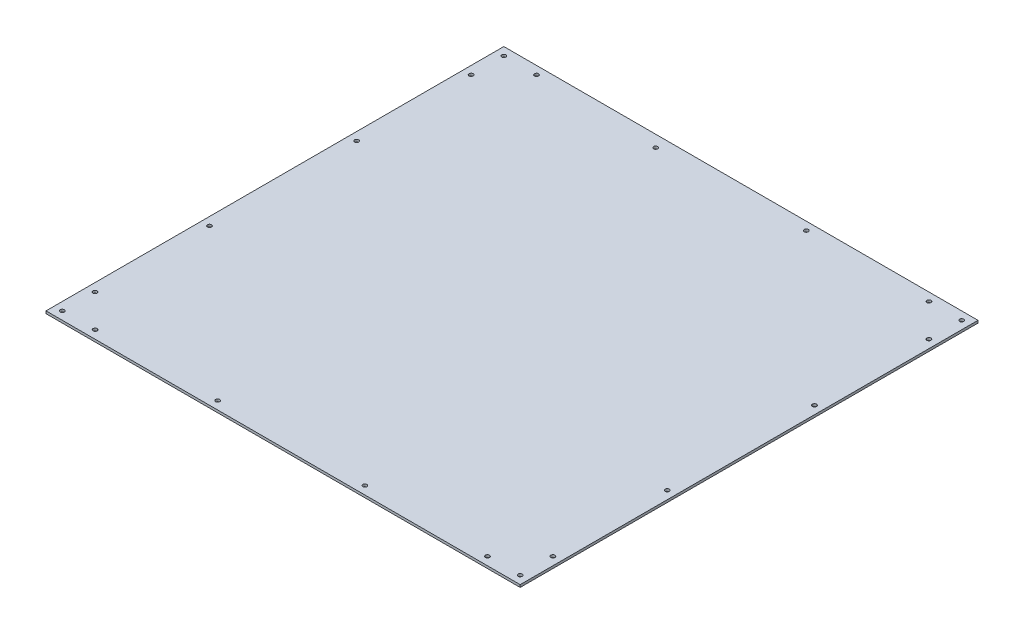
ISO-10303-21;
HEADER;
FILE_DESCRIPTION(('STEP AP214'),'2;1');
FILE_NAME('part.step','',(''),(''),'','','');
FILE_SCHEMA(('AUTOMOTIVE_DESIGN { 1 0 10303 214 1 1 1 1 }'));
ENDSEC;
DATA;
#1=APPLICATION_CONTEXT('core data for automotive mechanical design processes');
#2=APPLICATION_PROTOCOL_DEFINITION('international standard','automotive_design',2000,#1);
#3=PRODUCT_CONTEXT('',#1,'mechanical');
#4=PRODUCT('Part','Part','',(#3));
#5=PRODUCT_RELATED_PRODUCT_CATEGORY('part','',(#4));
#6=PRODUCT_DEFINITION_FORMATION('','',#4);
#7=PRODUCT_DEFINITION_CONTEXT('part definition',#1,'design');
#8=PRODUCT_DEFINITION('design','',#6,#7);
#9=PRODUCT_DEFINITION_SHAPE('','',#8);
#10=(LENGTH_UNIT() NAMED_UNIT(*) SI_UNIT(.MILLI.,.METRE.));
#11=(NAMED_UNIT(*) PLANE_ANGLE_UNIT() SI_UNIT($,.RADIAN.));
#12=(NAMED_UNIT(*) SI_UNIT($,.STERADIAN.) SOLID_ANGLE_UNIT());
#13=UNCERTAINTY_MEASURE_WITH_UNIT(LENGTH_MEASURE(1.E-05),#10,'distance_accuracy_value','');
#14=(GEOMETRIC_REPRESENTATION_CONTEXT(3) GLOBAL_UNCERTAINTY_ASSIGNED_CONTEXT((#13)) GLOBAL_UNIT_ASSIGNED_CONTEXT((#10,
#11,#12)) REPRESENTATION_CONTEXT('',''));
#15=CARTESIAN_POINT('',(0.,0.,0.));
#16=DIRECTION('',(0.,0.,1.));
#17=DIRECTION('',(1.,0.,0.));
#18=AXIS2_PLACEMENT_3D('',#15,#16,#17);
#19=CARTESIAN_POINT('',(0.,-3.,0.));
#20=DIRECTION('',(0.,-1.,0.));
#21=DIRECTION('',(1.,0.,0.));
#22=AXIS2_PLACEMENT_3D('',#19,#20,#21);
#23=PLANE('',#22);
#24=CARTESIAN_POINT('',(310.441640378549,-3.,279.085173501577));
#25=DIRECTION('',(0.,1.,0.));
#26=DIRECTION('',(0.,0.,-1.));
#27=AXIS2_PLACEMENT_3D('',#24,#25,#26);
#28=CIRCLE('',#27,2.5);
#29=CARTESIAN_POINT('',(310.441640378549,-3.,276.585173501577));
#30=VERTEX_POINT('',#29);
#31=EDGE_CURVE('E11',#30,#30,#28,.T.);
#32=ORIENTED_EDGE('',*,*,#31,.T.);
#33=EDGE_LOOP('',(#32));
#34=FACE_BOUND('',#33,.T.);
#35=CARTESIAN_POINT('',(-169.558359621451,-3.,-260.914826498423));
#36=DIRECTION('',(0.,1.,0.));
#37=DIRECTION('',(0.,0.,-1.));
#38=AXIS2_PLACEMENT_3D('',#35,#36,#37);
#39=CIRCLE('',#38,2.5);
#40=CARTESIAN_POINT('',(-169.558359621451,-3.,-263.414826498423));
#41=VERTEX_POINT('',#40);
#42=EDGE_CURVE('E24',#41,#41,#39,.T.);
#43=ORIENTED_EDGE('',*,*,#42,.T.);
#44=EDGE_LOOP('',(#43));
#45=FACE_BOUND('',#44,.T.);
#46=CARTESIAN_POINT('',(310.441640378549,-3.,-260.914826498423));
#47=DIRECTION('',(0.,-1.,0.));
#48=DIRECTION('',(0.,0.,-1.));
#49=AXIS2_PLACEMENT_3D('',#46,#47,#48);
#50=CIRCLE('',#49,2.5);
#51=CARTESIAN_POINT('',(310.441640378549,-3.,-263.414826498423));
#52=VERTEX_POINT('',#51);
#53=EDGE_CURVE('E200',#52,#52,#50,.T.);
#54=ORIENTED_EDGE('',*,*,#53,.F.);
#55=EDGE_LOOP('',(#54));
#56=FACE_BOUND('',#55,.T.);
#57=CARTESIAN_POINT('',(350.441640378549,-3.,-220.914826498423));
#58=DIRECTION('',(0.,-1.,0.));
#59=DIRECTION('',(0.,0.,-1.));
#60=AXIS2_PLACEMENT_3D('',#57,#58,#59);
#61=CIRCLE('',#60,2.5);
#62=CARTESIAN_POINT('',(350.441640378549,-3.,-223.414826498423));
#63=VERTEX_POINT('',#62);
#64=EDGE_CURVE('E197',#63,#63,#61,.T.);
#65=ORIENTED_EDGE('',*,*,#64,.F.);
#66=EDGE_LOOP('',(#65));
#67=FACE_BOUND('',#66,.T.);
#68=CARTESIAN_POINT('',(-209.558359621451,-3.,239.085173501577));
#69=DIRECTION('',(0.,-1.,0.));
#70=DIRECTION('',(0.,0.,-1.));
#71=AXIS2_PLACEMENT_3D('',#68,#69,#70);
#72=CIRCLE('',#71,2.5);
#73=CARTESIAN_POINT('',(-209.558359621451,-3.,236.585173501577));
#74=VERTEX_POINT('',#73);
#75=EDGE_CURVE('E194',#74,#74,#72,.T.);
#76=ORIENTED_EDGE('',*,*,#75,.F.);
#77=EDGE_LOOP('',(#76));
#78=FACE_BOUND('',#77,.T.);
#79=CARTESIAN_POINT('',(-19.558359621451,-3.,-256.625367838756));
#80=DIRECTION('',(0.,-1.,0.));
#81=DIRECTION('',(1.,0.,0.));
#82=AXIS2_PLACEMENT_3D('',#79,#80,#81);
#83=CIRCLE('',#82,2.5);
#84=CARTESIAN_POINT('',(-17.058359621451,-3.,-256.625367838756));
#85=VERTEX_POINT('',#84);
#86=EDGE_CURVE('E191',#85,#85,#83,.T.);
#87=ORIENTED_EDGE('',*,*,#86,.F.);
#88=EDGE_LOOP('',(#87));
#89=FACE_BOUND('',#88,.T.);
#90=CARTESIAN_POINT('',(350.441640378549,-3.,-260.914826498423));
#91=DIRECTION('',(0.,-1.,0.));
#92=DIRECTION('',(1.,0.,0.));
#93=AXIS2_PLACEMENT_3D('',#90,#91,#92);
#94=CIRCLE('',#93,2.49999999999997);
#95=CARTESIAN_POINT('',(352.941640378549,-3.,-260.914826498423));
#96=VERTEX_POINT('',#95);
#97=EDGE_CURVE('E188',#96,#96,#94,.T.);
#98=ORIENTED_EDGE('',*,*,#97,.F.);
#99=EDGE_LOOP('',(#98));
#100=FACE_BOUND('',#99,.T.);
#101=CARTESIAN_POINT('',(350.441640378549,-3.,-80.9148264984229));
#102=DIRECTION('',(0.,-1.,0.));
#103=DIRECTION('',(1.,0.,0.));
#104=AXIS2_PLACEMENT_3D('',#101,#102,#103);
#105=CIRCLE('',#104,2.49999999999997);
#106=CARTESIAN_POINT('',(352.941640378549,-3.,-80.9148264984229));
#107=VERTEX_POINT('',#106);
#108=EDGE_CURVE('E185',#107,#107,#105,.T.);
#109=ORIENTED_EDGE('',*,*,#108,.F.);
#110=EDGE_LOOP('',(#109));
#111=FACE_BOUND('',#110,.T.);
#112=CARTESIAN_POINT('',(350.441640378549,-3.,99.0851735015771));
#113=DIRECTION('',(0.,-1.,0.));
#114=DIRECTION('',(1.,0.,0.));
#115=AXIS2_PLACEMENT_3D('',#112,#113,#114);
#116=CIRCLE('',#115,2.49999999999997);
#117=CARTESIAN_POINT('',(352.941640378549,-3.,99.0851735015771));
#118=VERTEX_POINT('',#117);
#119=EDGE_CURVE('E182',#118,#118,#116,.T.);
#120=ORIENTED_EDGE('',*,*,#119,.F.);
#121=EDGE_LOOP('',(#120));
#122=FACE_BOUND('',#121,.T.);
#123=CARTESIAN_POINT('',(-209.558359621451,-3.,99.0851735015771));
#124=DIRECTION('',(0.,-1.,0.));
#125=DIRECTION('',(1.,0.,0.));
#126=AXIS2_PLACEMENT_3D('',#123,#124,#125);
#127=CIRCLE('',#126,2.5);
#128=CARTESIAN_POINT('',(-207.058359621451,-3.,99.0851735015771));
#129=VERTEX_POINT('',#128);
#130=EDGE_CURVE('E179',#129,#129,#127,.T.);
#131=ORIENTED_EDGE('',*,*,#130,.F.);
#132=EDGE_LOOP('',(#131));
#133=FACE_BOUND('',#132,.T.);
#134=CARTESIAN_POINT('',(-209.558359621451,-3.,-260.914826498423));
#135=DIRECTION('',(0.,-1.,0.));
#136=DIRECTION('',(1.,0.,0.));
#137=AXIS2_PLACEMENT_3D('',#134,#135,#136);
#138=CIRCLE('',#137,2.5);
#139=CARTESIAN_POINT('',(-207.058359621451,-3.,-260.914826498423));
#140=VERTEX_POINT('',#139);
#141=EDGE_CURVE('E176',#140,#140,#138,.T.);
#142=ORIENTED_EDGE('',*,*,#141,.F.);
#143=EDGE_LOOP('',(#142));
#144=FACE_BOUND('',#143,.T.);
#145=CARTESIAN_POINT('',(-209.558359621451,-3.,-80.9148264984229));
#146=DIRECTION('',(0.,-1.,0.));
#147=DIRECTION('',(1.,0.,0.));
#148=AXIS2_PLACEMENT_3D('',#145,#146,#147);
#149=CIRCLE('',#148,2.5);
#150=CARTESIAN_POINT('',(-207.058359621451,-3.,-80.9148264984229));
#151=VERTEX_POINT('',#150);
#152=EDGE_CURVE('E173',#151,#151,#149,.T.);
#153=ORIENTED_EDGE('',*,*,#152,.F.);
#154=EDGE_LOOP('',(#153));
#155=FACE_BOUND('',#154,.T.);
#156=CARTESIAN_POINT('',(350.441640378549,-3.,279.085173501577));
#157=DIRECTION('',(0.,-1.,0.));
#158=DIRECTION('',(1.,0.,0.));
#159=AXIS2_PLACEMENT_3D('',#156,#157,#158);
#160=CIRCLE('',#159,2.49999999999997);
#161=CARTESIAN_POINT('',(352.941640378549,-3.,279.085173501577));
#162=VERTEX_POINT('',#161);
#163=EDGE_CURVE('E170',#162,#162,#160,.T.);
#164=ORIENTED_EDGE('',*,*,#163,.F.);
#165=EDGE_LOOP('',(#164));
#166=FACE_BOUND('',#165,.T.);
#167=CARTESIAN_POINT('',(160.441640378549,-3.,279.085173501577));
#168=DIRECTION('',(0.,-1.,0.));
#169=DIRECTION('',(1.,0.,0.));
#170=AXIS2_PLACEMENT_3D('',#167,#168,#169);
#171=CIRCLE('',#170,2.5);
#172=CARTESIAN_POINT('',(162.941640378549,-3.,279.085173501577));
#173=VERTEX_POINT('',#172);
#174=EDGE_CURVE('E167',#173,#173,#171,.T.);
#175=ORIENTED_EDGE('',*,*,#174,.F.);
#176=EDGE_LOOP('',(#175));
#177=FACE_BOUND('',#176,.T.);
#178=CARTESIAN_POINT('',(-19.558359621451,-3.,279.085173501577));
#179=DIRECTION('',(0.,-1.,0.));
#180=DIRECTION('',(1.,0.,0.));
#181=AXIS2_PLACEMENT_3D('',#178,#179,#180);
#182=CIRCLE('',#181,2.5);
#183=CARTESIAN_POINT('',(-17.058359621451,-3.,279.085173501577));
#184=VERTEX_POINT('',#183);
#185=EDGE_CURVE('E164',#184,#184,#182,.T.);
#186=ORIENTED_EDGE('',*,*,#185,.F.);
#187=EDGE_LOOP('',(#186));
#188=FACE_BOUND('',#187,.T.);
#189=CARTESIAN_POINT('',(160.441640378549,-3.,-260.914826498423));
#190=DIRECTION('',(0.,-1.,0.));
#191=DIRECTION('',(1.,0.,0.));
#192=AXIS2_PLACEMENT_3D('',#189,#190,#191);
#193=CIRCLE('',#192,2.5);
#194=CARTESIAN_POINT('',(162.941640378549,-3.,-260.914826498423));
#195=VERTEX_POINT('',#194);
#196=EDGE_CURVE('E161',#195,#195,#193,.T.);
#197=ORIENTED_EDGE('',*,*,#196,.F.);
#198=EDGE_LOOP('',(#197));
#199=FACE_BOUND('',#198,.T.);
#200=CARTESIAN_POINT('',(-209.558359621451,-3.,279.085173501577));
#201=DIRECTION('',(0.,-1.,0.));
#202=DIRECTION('',(1.,0.,0.));
#203=AXIS2_PLACEMENT_3D('',#200,#201,#202);
#204=CIRCLE('',#203,2.5);
#205=CARTESIAN_POINT('',(-207.058359621451,-3.,279.085173501577));
#206=VERTEX_POINT('',#205);
#207=EDGE_CURVE('E158',#206,#206,#204,.T.);
#208=ORIENTED_EDGE('',*,*,#207,.F.);
#209=EDGE_LOOP('',(#208));
#210=FACE_BOUND('',#209,.T.);
#211=DIRECTION('',(0.,0.,-1.));
#212=VECTOR('',#211,1.);
#213=CARTESIAN_POINT('',(-219.558359621451,-3.,289.085173501577));
#214=LINE('',#213,#212);
#215=CARTESIAN_POINT('',(-219.558359621451,-3.,289.085173501577));
#216=VERTEX_POINT('',#215);
#217=CARTESIAN_POINT('',(-219.558359621451,-3.,-270.914826498423));
#218=VERTEX_POINT('',#217);
#219=EDGE_CURVE('E31',#216,#218,#214,.T.);
#220=ORIENTED_EDGE('',*,*,#219,.T.);
#221=DIRECTION('',(1.,0.,0.));
#222=VECTOR('',#221,1.);
#223=CARTESIAN_POINT('',(-219.558359621451,-3.,-270.914826498423));
#224=LINE('',#223,#222);
#225=CARTESIAN_POINT('',(360.441640378549,-3.,-270.914826498423));
#226=VERTEX_POINT('',#225);
#227=EDGE_CURVE('E36',#218,#226,#224,.T.);
#228=ORIENTED_EDGE('',*,*,#227,.T.);
#229=DIRECTION('',(0.,0.,1.));
#230=VECTOR('',#229,1.);
#231=CARTESIAN_POINT('',(360.441640378549,-3.,289.085173501577));
#232=LINE('',#231,#230);
#233=CARTESIAN_POINT('',(360.441640378549,-3.,289.085173501577));
#234=VERTEX_POINT('',#233);
#235=EDGE_CURVE('E154',#226,#234,#232,.T.);
#236=ORIENTED_EDGE('',*,*,#235,.T.);
#237=DIRECTION('',(-1.,0.,0.));
#238=VECTOR('',#237,1.);
#239=CARTESIAN_POINT('',(-219.558359621451,-3.,289.085173501577));
#240=LINE('',#239,#238);
#241=EDGE_CURVE('E152',#234,#216,#240,.T.);
#242=ORIENTED_EDGE('',*,*,#241,.T.);
#243=EDGE_LOOP('',(#220,#228,#236,#242));
#244=FACE_BOUND('',#243,.T.);
#245=CARTESIAN_POINT('',(-169.558359621451,-3.,279.085173501577));
#246=DIRECTION('',(0.,-1.,0.));
#247=DIRECTION('',(0.,0.,-1.));
#248=AXIS2_PLACEMENT_3D('',#245,#246,#247);
#249=CIRCLE('',#248,2.5);
#250=CARTESIAN_POINT('',(-169.558359621451,-3.,276.585173501577));
#251=VERTEX_POINT('',#250);
#252=EDGE_CURVE('E149',#251,#251,#249,.T.);
#253=ORIENTED_EDGE('',*,*,#252,.F.);
#254=EDGE_LOOP('',(#253));
#255=FACE_BOUND('',#254,.T.);
#256=CARTESIAN_POINT('',(350.441640378549,-3.,239.085173501577));
#257=DIRECTION('',(0.,1.,0.));
#258=DIRECTION('',(0.,0.,-1.));
#259=AXIS2_PLACEMENT_3D('',#256,#257,#258);
#260=CIRCLE('',#259,2.5);
#261=CARTESIAN_POINT('',(350.441640378549,-3.,236.585173501577));
#262=VERTEX_POINT('',#261);
#263=EDGE_CURVE('E146',#262,#262,#260,.T.);
#264=ORIENTED_EDGE('',*,*,#263,.T.);
#265=EDGE_LOOP('',(#264));
#266=FACE_BOUND('',#265,.T.);
#267=CARTESIAN_POINT('',(-209.558359621451,-3.,-220.914826498423));
#268=DIRECTION('',(0.,1.,0.));
#269=DIRECTION('',(0.,0.,-1.));
#270=AXIS2_PLACEMENT_3D('',#267,#268,#269);
#271=CIRCLE('',#270,2.5);
#272=CARTESIAN_POINT('',(-209.558359621451,-3.,-223.414826498423));
#273=VERTEX_POINT('',#272);
#274=EDGE_CURVE('E143',#273,#273,#271,.T.);
#275=ORIENTED_EDGE('',*,*,#274,.T.);
#276=EDGE_LOOP('',(#275));
#277=FACE_BOUND('',#276,.T.);
#278=ADVANCED_FACE('F17',(#34,#45,#56,#67,#78,#89,#100,#111,#122,#133,#144,#155,#166,#177,#188,
#199,#210,#244,#255,#266,#277),#23,.T.);
#279=CARTESIAN_POINT('',(0.,0.,0.));
#280=DIRECTION('',(0.,-1.,0.));
#281=DIRECTION('',(1.,0.,0.));
#282=AXIS2_PLACEMENT_3D('',#279,#280,#281);
#283=PLANE('',#282);
#284=CARTESIAN_POINT('',(-169.558359621451,0.,279.085173501577));
#285=DIRECTION('',(0.,-1.,0.));
#286=DIRECTION('',(0.,0.,-1.));
#287=AXIS2_PLACEMENT_3D('',#284,#285,#286);
#288=CIRCLE('',#287,2.5);
#289=CARTESIAN_POINT('',(-169.558359621451,0.,276.585173501577));
#290=VERTEX_POINT('',#289);
#291=EDGE_CURVE('E140',#290,#290,#288,.T.);
#292=ORIENTED_EDGE('',*,*,#291,.T.);
#293=EDGE_LOOP('',(#292));
#294=FACE_BOUND('',#293,.T.);
#295=CARTESIAN_POINT('',(310.441640378549,0.,-260.914826498423));
#296=DIRECTION('',(0.,-1.,0.));
#297=DIRECTION('',(0.,0.,-1.));
#298=AXIS2_PLACEMENT_3D('',#295,#296,#297);
#299=CIRCLE('',#298,2.5);
#300=CARTESIAN_POINT('',(310.441640378549,0.,-263.414826498423));
#301=VERTEX_POINT('',#300);
#302=EDGE_CURVE('E137',#301,#301,#299,.T.);
#303=ORIENTED_EDGE('',*,*,#302,.T.);
#304=EDGE_LOOP('',(#303));
#305=FACE_BOUND('',#304,.T.);
#306=CARTESIAN_POINT('',(350.441640378549,0.,-220.914826498423));
#307=DIRECTION('',(0.,-1.,0.));
#308=DIRECTION('',(0.,0.,-1.));
#309=AXIS2_PLACEMENT_3D('',#306,#307,#308);
#310=CIRCLE('',#309,2.5);
#311=CARTESIAN_POINT('',(350.441640378549,0.,-223.414826498423));
#312=VERTEX_POINT('',#311);
#313=EDGE_CURVE('E134',#312,#312,#310,.T.);
#314=ORIENTED_EDGE('',*,*,#313,.T.);
#315=EDGE_LOOP('',(#314));
#316=FACE_BOUND('',#315,.T.);
#317=CARTESIAN_POINT('',(-209.558359621451,0.,239.085173501577));
#318=DIRECTION('',(0.,-1.,0.));
#319=DIRECTION('',(0.,0.,-1.));
#320=AXIS2_PLACEMENT_3D('',#317,#318,#319);
#321=CIRCLE('',#320,2.5);
#322=CARTESIAN_POINT('',(-209.558359621451,0.,236.585173501577));
#323=VERTEX_POINT('',#322);
#324=EDGE_CURVE('E131',#323,#323,#321,.T.);
#325=ORIENTED_EDGE('',*,*,#324,.T.);
#326=EDGE_LOOP('',(#325));
#327=FACE_BOUND('',#326,.T.);
#328=CARTESIAN_POINT('',(-19.558359621451,0.,-256.625367838756));
#329=DIRECTION('',(0.,-1.,0.));
#330=DIRECTION('',(1.,0.,0.));
#331=AXIS2_PLACEMENT_3D('',#328,#329,#330);
#332=CIRCLE('',#331,2.5);
#333=CARTESIAN_POINT('',(-17.058359621451,0.,-256.625367838756));
#334=VERTEX_POINT('',#333);
#335=EDGE_CURVE('E128',#334,#334,#332,.T.);
#336=ORIENTED_EDGE('',*,*,#335,.T.);
#337=EDGE_LOOP('',(#336));
#338=FACE_BOUND('',#337,.T.);
#339=CARTESIAN_POINT('',(350.441640378549,0.,-260.914826498423));
#340=DIRECTION('',(0.,-1.,0.));
#341=DIRECTION('',(1.,0.,0.));
#342=AXIS2_PLACEMENT_3D('',#339,#340,#341);
#343=CIRCLE('',#342,2.49999999999997);
#344=CARTESIAN_POINT('',(352.941640378549,0.,-260.914826498423));
#345=VERTEX_POINT('',#344);
#346=EDGE_CURVE('E125',#345,#345,#343,.T.);
#347=ORIENTED_EDGE('',*,*,#346,.T.);
#348=EDGE_LOOP('',(#347));
#349=FACE_BOUND('',#348,.T.);
#350=CARTESIAN_POINT('',(350.441640378549,0.,-80.9148264984229));
#351=DIRECTION('',(0.,-1.,0.));
#352=DIRECTION('',(1.,0.,0.));
#353=AXIS2_PLACEMENT_3D('',#350,#351,#352);
#354=CIRCLE('',#353,2.49999999999997);
#355=CARTESIAN_POINT('',(352.941640378549,0.,-80.9148264984229));
#356=VERTEX_POINT('',#355);
#357=EDGE_CURVE('E122',#356,#356,#354,.T.);
#358=ORIENTED_EDGE('',*,*,#357,.T.);
#359=EDGE_LOOP('',(#358));
#360=FACE_BOUND('',#359,.T.);
#361=CARTESIAN_POINT('',(350.441640378549,0.,99.0851735015771));
#362=DIRECTION('',(0.,-1.,0.));
#363=DIRECTION('',(1.,0.,0.));
#364=AXIS2_PLACEMENT_3D('',#361,#362,#363);
#365=CIRCLE('',#364,2.49999999999997);
#366=CARTESIAN_POINT('',(352.941640378549,0.,99.0851735015771));
#367=VERTEX_POINT('',#366);
#368=EDGE_CURVE('E119',#367,#367,#365,.T.);
#369=ORIENTED_EDGE('',*,*,#368,.T.);
#370=EDGE_LOOP('',(#369));
#371=FACE_BOUND('',#370,.T.);
#372=CARTESIAN_POINT('',(-209.558359621451,0.,99.0851735015771));
#373=DIRECTION('',(0.,-1.,0.));
#374=DIRECTION('',(1.,0.,0.));
#375=AXIS2_PLACEMENT_3D('',#372,#373,#374);
#376=CIRCLE('',#375,2.5);
#377=CARTESIAN_POINT('',(-207.058359621451,0.,99.0851735015771));
#378=VERTEX_POINT('',#377);
#379=EDGE_CURVE('E116',#378,#378,#376,.T.);
#380=ORIENTED_EDGE('',*,*,#379,.T.);
#381=EDGE_LOOP('',(#380));
#382=FACE_BOUND('',#381,.T.);
#383=CARTESIAN_POINT('',(-209.558359621451,0.,-260.914826498423));
#384=DIRECTION('',(0.,-1.,0.));
#385=DIRECTION('',(1.,0.,0.));
#386=AXIS2_PLACEMENT_3D('',#383,#384,#385);
#387=CIRCLE('',#386,2.5);
#388=CARTESIAN_POINT('',(-207.058359621451,0.,-260.914826498423));
#389=VERTEX_POINT('',#388);
#390=EDGE_CURVE('E113',#389,#389,#387,.T.);
#391=ORIENTED_EDGE('',*,*,#390,.T.);
#392=EDGE_LOOP('',(#391));
#393=FACE_BOUND('',#392,.T.);
#394=CARTESIAN_POINT('',(-209.558359621451,0.,-80.9148264984229));
#395=DIRECTION('',(0.,-1.,0.));
#396=DIRECTION('',(1.,0.,0.));
#397=AXIS2_PLACEMENT_3D('',#394,#395,#396);
#398=CIRCLE('',#397,2.5);
#399=CARTESIAN_POINT('',(-207.058359621451,0.,-80.9148264984229));
#400=VERTEX_POINT('',#399);
#401=EDGE_CURVE('E110',#400,#400,#398,.T.);
#402=ORIENTED_EDGE('',*,*,#401,.T.);
#403=EDGE_LOOP('',(#402));
#404=FACE_BOUND('',#403,.T.);
#405=CARTESIAN_POINT('',(350.441640378549,0.,279.085173501577));
#406=DIRECTION('',(0.,-1.,0.));
#407=DIRECTION('',(1.,0.,0.));
#408=AXIS2_PLACEMENT_3D('',#405,#406,#407);
#409=CIRCLE('',#408,2.49999999999997);
#410=CARTESIAN_POINT('',(352.941640378549,0.,279.085173501577));
#411=VERTEX_POINT('',#410);
#412=EDGE_CURVE('E107',#411,#411,#409,.T.);
#413=ORIENTED_EDGE('',*,*,#412,.T.);
#414=EDGE_LOOP('',(#413));
#415=FACE_BOUND('',#414,.T.);
#416=CARTESIAN_POINT('',(160.441640378549,0.,279.085173501577));
#417=DIRECTION('',(0.,-1.,0.));
#418=DIRECTION('',(1.,0.,0.));
#419=AXIS2_PLACEMENT_3D('',#416,#417,#418);
#420=CIRCLE('',#419,2.5);
#421=CARTESIAN_POINT('',(162.941640378549,0.,279.085173501577));
#422=VERTEX_POINT('',#421);
#423=EDGE_CURVE('E104',#422,#422,#420,.T.);
#424=ORIENTED_EDGE('',*,*,#423,.T.);
#425=EDGE_LOOP('',(#424));
#426=FACE_BOUND('',#425,.T.);
#427=CARTESIAN_POINT('',(-19.558359621451,0.,279.085173501577));
#428=DIRECTION('',(0.,-1.,0.));
#429=DIRECTION('',(1.,0.,0.));
#430=AXIS2_PLACEMENT_3D('',#427,#428,#429);
#431=CIRCLE('',#430,2.5);
#432=CARTESIAN_POINT('',(-17.058359621451,0.,279.085173501577));
#433=VERTEX_POINT('',#432);
#434=EDGE_CURVE('E101',#433,#433,#431,.T.);
#435=ORIENTED_EDGE('',*,*,#434,.T.);
#436=EDGE_LOOP('',(#435));
#437=FACE_BOUND('',#436,.T.);
#438=CARTESIAN_POINT('',(160.441640378549,0.,-260.914826498423));
#439=DIRECTION('',(0.,-1.,0.));
#440=DIRECTION('',(1.,0.,0.));
#441=AXIS2_PLACEMENT_3D('',#438,#439,#440);
#442=CIRCLE('',#441,2.5);
#443=CARTESIAN_POINT('',(162.941640378549,0.,-260.914826498423));
#444=VERTEX_POINT('',#443);
#445=EDGE_CURVE('E98',#444,#444,#442,.T.);
#446=ORIENTED_EDGE('',*,*,#445,.T.);
#447=EDGE_LOOP('',(#446));
#448=FACE_BOUND('',#447,.T.);
#449=CARTESIAN_POINT('',(-209.558359621451,0.,279.085173501577));
#450=DIRECTION('',(0.,-1.,0.));
#451=DIRECTION('',(1.,0.,0.));
#452=AXIS2_PLACEMENT_3D('',#449,#450,#451);
#453=CIRCLE('',#452,2.5);
#454=CARTESIAN_POINT('',(-207.058359621451,0.,279.085173501577));
#455=VERTEX_POINT('',#454);
#456=EDGE_CURVE('E74',#455,#455,#453,.T.);
#457=ORIENTED_EDGE('',*,*,#456,.T.);
#458=EDGE_LOOP('',(#457));
#459=FACE_BOUND('',#458,.T.);
#460=DIRECTION('',(0.,0.,-1.));
#461=VECTOR('',#460,1.);
#462=CARTESIAN_POINT('',(-219.558359621451,0.,289.085173501577));
#463=LINE('',#462,#461);
#464=CARTESIAN_POINT('',(-219.558359621451,0.,289.085173501577));
#465=VERTEX_POINT('',#464);
#466=CARTESIAN_POINT('',(-219.558359621451,0.,-270.914826498423));
#467=VERTEX_POINT('',#466);
#468=EDGE_CURVE('E59',#465,#467,#463,.T.);
#469=ORIENTED_EDGE('',*,*,#468,.F.);
#470=DIRECTION('',(-1.,0.,0.));
#471=VECTOR('',#470,1.);
#472=CARTESIAN_POINT('',(-219.558359621451,0.,289.085173501577));
#473=LINE('',#472,#471);
#474=CARTESIAN_POINT('',(360.441640378549,0.,289.085173501577));
#475=VERTEX_POINT('',#474);
#476=EDGE_CURVE('E75',#475,#465,#473,.T.);
#477=ORIENTED_EDGE('',*,*,#476,.F.);
#478=DIRECTION('',(0.,0.,1.));
#479=VECTOR('',#478,1.);
#480=CARTESIAN_POINT('',(360.441640378549,0.,289.085173501577));
#481=LINE('',#480,#479);
#482=CARTESIAN_POINT('',(360.441640378549,0.,-270.914826498423));
#483=VERTEX_POINT('',#482);
#484=EDGE_CURVE('E62',#483,#475,#481,.T.);
#485=ORIENTED_EDGE('',*,*,#484,.F.);
#486=DIRECTION('',(1.,0.,0.));
#487=VECTOR('',#486,1.);
#488=CARTESIAN_POINT('',(-219.558359621451,0.,-270.914826498423));
#489=LINE('',#488,#487);
#490=EDGE_CURVE('E55',#467,#483,#489,.T.);
#491=ORIENTED_EDGE('',*,*,#490,.F.);
#492=EDGE_LOOP('',(#469,#477,#485,#491));
#493=FACE_BOUND('',#492,.T.);
#494=CARTESIAN_POINT('',(-169.558359621451,0.,-260.914826498423));
#495=DIRECTION('',(0.,-1.,0.));
#496=DIRECTION('',(0.,0.,-1.));
#497=AXIS2_PLACEMENT_3D('',#494,#495,#496);
#498=CIRCLE('',#497,2.5);
#499=CARTESIAN_POINT('',(-169.558359621451,0.,-263.414826498423));
#500=VERTEX_POINT('',#499);
#501=EDGE_CURVE('E66',#500,#500,#498,.F.);
#502=ORIENTED_EDGE('',*,*,#501,.F.);
#503=EDGE_LOOP('',(#502));
#504=FACE_BOUND('',#503,.T.);
#505=CARTESIAN_POINT('',(350.441640378549,0.,239.085173501577));
#506=DIRECTION('',(0.,-1.,0.));
#507=DIRECTION('',(0.,0.,-1.));
#508=AXIS2_PLACEMENT_3D('',#505,#506,#507);
#509=CIRCLE('',#508,2.5);
#510=CARTESIAN_POINT('',(350.441640378549,0.,236.585173501577));
#511=VERTEX_POINT('',#510);
#512=EDGE_CURVE('E89',#511,#511,#509,.F.);
#513=ORIENTED_EDGE('',*,*,#512,.F.);
#514=EDGE_LOOP('',(#513));
#515=FACE_BOUND('',#514,.T.);
#516=CARTESIAN_POINT('',(310.441640378549,0.,279.085173501577));
#517=DIRECTION('',(0.,-1.,0.));
#518=DIRECTION('',(0.,0.,-1.));
#519=AXIS2_PLACEMENT_3D('',#516,#517,#518);
#520=CIRCLE('',#519,2.5);
#521=CARTESIAN_POINT('',(310.441640378549,0.,276.585173501577));
#522=VERTEX_POINT('',#521);
#523=EDGE_CURVE('E81',#522,#522,#520,.F.);
#524=ORIENTED_EDGE('',*,*,#523,.F.);
#525=EDGE_LOOP('',(#524));
#526=FACE_BOUND('',#525,.T.);
#527=CARTESIAN_POINT('',(-209.558359621451,0.,-220.914826498423));
#528=DIRECTION('',(0.,-1.,0.));
#529=DIRECTION('',(0.,0.,-1.));
#530=AXIS2_PLACEMENT_3D('',#527,#528,#529);
#531=CIRCLE('',#530,2.5);
#532=CARTESIAN_POINT('',(-209.558359621451,0.,-223.414826498423));
#533=VERTEX_POINT('',#532);
#534=EDGE_CURVE('E78',#533,#533,#531,.F.);
#535=ORIENTED_EDGE('',*,*,#534,.F.);
#536=EDGE_LOOP('',(#535));
#537=FACE_BOUND('',#536,.T.);
#538=ADVANCED_FACE('F57',(#294,#305,#316,#327,#338,#349,#360,#371,#382,#393,#404,#415,#426,#437,
#448,#459,#493,#504,#515,#526,#537),#283,.F.);
#539=CARTESIAN_POINT('',(-219.558359621451,-3.,289.085173501577));
#540=DIRECTION('',(1.,0.,0.));
#541=DIRECTION('',(0.,0.,1.));
#542=AXIS2_PLACEMENT_3D('',#539,#540,#541);
#543=PLANE('',#542);
#544=ORIENTED_EDGE('',*,*,#468,.T.);
#545=DIRECTION('',(0.,1.,0.));
#546=VECTOR('',#545,1.);
#547=CARTESIAN_POINT('',(-219.558359621451,-3.,-270.914826498423));
#548=LINE('',#547,#546);
#549=EDGE_CURVE('E70',#218,#467,#548,.T.);
#550=ORIENTED_EDGE('',*,*,#549,.F.);
#551=ORIENTED_EDGE('',*,*,#219,.F.);
#552=DIRECTION('',(0.,1.,0.));
#553=VECTOR('',#552,1.);
#554=CARTESIAN_POINT('',(-219.558359621451,-3.,289.085173501577));
#555=LINE('',#554,#553);
#556=EDGE_CURVE('E72',#216,#465,#555,.T.);
#557=ORIENTED_EDGE('',*,*,#556,.T.);
#558=EDGE_LOOP('',(#544,#550,#551,#557));
#559=FACE_BOUND('',#558,.T.);
#560=ADVANCED_FACE('F69',(#559),#543,.F.);
#561=CARTESIAN_POINT('',(-219.558359621451,-3.,-270.914826498423));
#562=DIRECTION('',(0.,0.,1.));
#563=DIRECTION('',(0.,-1.,0.));
#564=AXIS2_PLACEMENT_3D('',#561,#562,#563);
#565=PLANE('',#564);
#566=ORIENTED_EDGE('',*,*,#490,.T.);
#567=DIRECTION('',(0.,1.,0.));
#568=VECTOR('',#567,1.);
#569=CARTESIAN_POINT('',(360.441640378549,-3.,-270.914826498423));
#570=LINE('',#569,#568);
#571=EDGE_CURVE('E83',#226,#483,#570,.T.);
#572=ORIENTED_EDGE('',*,*,#571,.F.);
#573=ORIENTED_EDGE('',*,*,#227,.F.);
#574=ORIENTED_EDGE('',*,*,#549,.T.);
#575=EDGE_LOOP('',(#566,#572,#573,#574));
#576=FACE_BOUND('',#575,.T.);
#577=ADVANCED_FACE('F77',(#576),#565,.F.);
#578=CARTESIAN_POINT('',(360.441640378549,-3.,289.085173501577));
#579=DIRECTION('',(-1.,0.,0.));
#580=DIRECTION('',(0.,0.,-1.));
#581=AXIS2_PLACEMENT_3D('',#578,#579,#580);
#582=PLANE('',#581);
#583=ORIENTED_EDGE('',*,*,#484,.T.);
#584=DIRECTION('',(0.,1.,0.));
#585=VECTOR('',#584,1.);
#586=CARTESIAN_POINT('',(360.441640378549,-3.,289.085173501577));
#587=LINE('',#586,#585);
#588=EDGE_CURVE('E567',#234,#475,#587,.T.);
#589=ORIENTED_EDGE('',*,*,#588,.F.);
#590=ORIENTED_EDGE('',*,*,#235,.F.);
#591=ORIENTED_EDGE('',*,*,#571,.T.);
#592=EDGE_LOOP('',(#583,#589,#590,#591));
#593=FACE_BOUND('',#592,.T.);
#594=ADVANCED_FACE('F268',(#593),#582,.F.);
#595=CARTESIAN_POINT('',(-219.558359621451,-3.,289.085173501577));
#596=DIRECTION('',(0.,0.,-1.));
#597=DIRECTION('',(0.,1.,0.));
#598=AXIS2_PLACEMENT_3D('',#595,#596,#597);
#599=PLANE('',#598);
#600=ORIENTED_EDGE('',*,*,#476,.T.);
#601=ORIENTED_EDGE('',*,*,#556,.F.);
#602=ORIENTED_EDGE('',*,*,#241,.F.);
#603=ORIENTED_EDGE('',*,*,#588,.T.);
#604=EDGE_LOOP('',(#600,#601,#602,#603));
#605=FACE_BOUND('',#604,.T.);
#606=ADVANCED_FACE('F276',(#605),#599,.F.);
#607=CARTESIAN_POINT('',(-209.558359621451,0.,279.085173501577));
#608=DIRECTION('',(0.,-1.,0.));
#609=DIRECTION('',(1.,0.,0.));
#610=AXIS2_PLACEMENT_3D('',#607,#608,#609);
#611=CYLINDRICAL_SURFACE('',#610,2.5);
#612=ORIENTED_EDGE('',*,*,#456,.F.);
#613=EDGE_LOOP('',(#612));
#614=FACE_BOUND('',#613,.T.);
#615=ORIENTED_EDGE('',*,*,#207,.T.);
#616=EDGE_LOOP('',(#615));
#617=FACE_BOUND('',#616,.T.);
#618=ADVANCED_FACE('F285',(#614,#617),#611,.F.);
#619=CARTESIAN_POINT('',(160.441640378549,0.,-260.914826498423));
#620=DIRECTION('',(0.,-1.,0.));
#621=DIRECTION('',(1.,0.,0.));
#622=AXIS2_PLACEMENT_3D('',#619,#620,#621);
#623=CYLINDRICAL_SURFACE('',#622,2.5);
#624=ORIENTED_EDGE('',*,*,#445,.F.);
#625=EDGE_LOOP('',(#624));
#626=FACE_BOUND('',#625,.T.);
#627=ORIENTED_EDGE('',*,*,#196,.T.);
#628=EDGE_LOOP('',(#627));
#629=FACE_BOUND('',#628,.T.);
#630=ADVANCED_FACE('F294',(#626,#629),#623,.F.);
#631=CARTESIAN_POINT('',(-19.558359621451,0.,279.085173501577));
#632=DIRECTION('',(0.,-1.,0.));
#633=DIRECTION('',(1.,0.,0.));
#634=AXIS2_PLACEMENT_3D('',#631,#632,#633);
#635=CYLINDRICAL_SURFACE('',#634,2.5);
#636=ORIENTED_EDGE('',*,*,#434,.F.);
#637=EDGE_LOOP('',(#636));
#638=FACE_BOUND('',#637,.T.);
#639=ORIENTED_EDGE('',*,*,#185,.T.);
#640=EDGE_LOOP('',(#639));
#641=FACE_BOUND('',#640,.T.);
#642=ADVANCED_FACE('F303',(#638,#641),#635,.F.);
#643=CARTESIAN_POINT('',(160.441640378549,0.,279.085173501577));
#644=DIRECTION('',(0.,-1.,0.));
#645=DIRECTION('',(1.,0.,0.));
#646=AXIS2_PLACEMENT_3D('',#643,#644,#645);
#647=CYLINDRICAL_SURFACE('',#646,2.5);
#648=ORIENTED_EDGE('',*,*,#423,.F.);
#649=EDGE_LOOP('',(#648));
#650=FACE_BOUND('',#649,.T.);
#651=ORIENTED_EDGE('',*,*,#174,.T.);
#652=EDGE_LOOP('',(#651));
#653=FACE_BOUND('',#652,.T.);
#654=ADVANCED_FACE('F312',(#650,#653),#647,.F.);
#655=CARTESIAN_POINT('',(350.441640378549,0.,279.085173501577));
#656=DIRECTION('',(0.,-1.,0.));
#657=DIRECTION('',(1.,0.,0.));
#658=AXIS2_PLACEMENT_3D('',#655,#656,#657);
#659=CYLINDRICAL_SURFACE('',#658,2.49999999999997);
#660=ORIENTED_EDGE('',*,*,#412,.F.);
#661=EDGE_LOOP('',(#660));
#662=FACE_BOUND('',#661,.T.);
#663=ORIENTED_EDGE('',*,*,#163,.T.);
#664=EDGE_LOOP('',(#663));
#665=FACE_BOUND('',#664,.T.);
#666=ADVANCED_FACE('F321',(#662,#665),#659,.F.);
#667=CARTESIAN_POINT('',(-209.558359621451,0.,-80.9148264984229));
#668=DIRECTION('',(0.,-1.,0.));
#669=DIRECTION('',(1.,0.,0.));
#670=AXIS2_PLACEMENT_3D('',#667,#668,#669);
#671=CYLINDRICAL_SURFACE('',#670,2.5);
#672=ORIENTED_EDGE('',*,*,#401,.F.);
#673=EDGE_LOOP('',(#672));
#674=FACE_BOUND('',#673,.T.);
#675=ORIENTED_EDGE('',*,*,#152,.T.);
#676=EDGE_LOOP('',(#675));
#677=FACE_BOUND('',#676,.T.);
#678=ADVANCED_FACE('F330',(#674,#677),#671,.F.);
#679=CARTESIAN_POINT('',(-209.558359621451,0.,-260.914826498423));
#680=DIRECTION('',(0.,-1.,0.));
#681=DIRECTION('',(1.,0.,0.));
#682=AXIS2_PLACEMENT_3D('',#679,#680,#681);
#683=CYLINDRICAL_SURFACE('',#682,2.5);
#684=ORIENTED_EDGE('',*,*,#390,.F.);
#685=EDGE_LOOP('',(#684));
#686=FACE_BOUND('',#685,.T.);
#687=ORIENTED_EDGE('',*,*,#141,.T.);
#688=EDGE_LOOP('',(#687));
#689=FACE_BOUND('',#688,.T.);
#690=ADVANCED_FACE('F339',(#686,#689),#683,.F.);
#691=CARTESIAN_POINT('',(-209.558359621451,0.,99.0851735015771));
#692=DIRECTION('',(0.,-1.,0.));
#693=DIRECTION('',(1.,0.,0.));
#694=AXIS2_PLACEMENT_3D('',#691,#692,#693);
#695=CYLINDRICAL_SURFACE('',#694,2.5);
#696=ORIENTED_EDGE('',*,*,#379,.F.);
#697=EDGE_LOOP('',(#696));
#698=FACE_BOUND('',#697,.T.);
#699=ORIENTED_EDGE('',*,*,#130,.T.);
#700=EDGE_LOOP('',(#699));
#701=FACE_BOUND('',#700,.T.);
#702=ADVANCED_FACE('F348',(#698,#701),#695,.F.);
#703=CARTESIAN_POINT('',(350.441640378549,0.,99.0851735015771));
#704=DIRECTION('',(0.,-1.,0.));
#705=DIRECTION('',(1.,0.,0.));
#706=AXIS2_PLACEMENT_3D('',#703,#704,#705);
#707=CYLINDRICAL_SURFACE('',#706,2.49999999999997);
#708=ORIENTED_EDGE('',*,*,#368,.F.);
#709=EDGE_LOOP('',(#708));
#710=FACE_BOUND('',#709,.T.);
#711=ORIENTED_EDGE('',*,*,#119,.T.);
#712=EDGE_LOOP('',(#711));
#713=FACE_BOUND('',#712,.T.);
#714=ADVANCED_FACE('F357',(#710,#713),#707,.F.);
#715=CARTESIAN_POINT('',(350.441640378549,0.,-80.9148264984229));
#716=DIRECTION('',(0.,-1.,0.));
#717=DIRECTION('',(1.,0.,0.));
#718=AXIS2_PLACEMENT_3D('',#715,#716,#717);
#719=CYLINDRICAL_SURFACE('',#718,2.49999999999997);
#720=ORIENTED_EDGE('',*,*,#357,.F.);
#721=EDGE_LOOP('',(#720));
#722=FACE_BOUND('',#721,.T.);
#723=ORIENTED_EDGE('',*,*,#108,.T.);
#724=EDGE_LOOP('',(#723));
#725=FACE_BOUND('',#724,.T.);
#726=ADVANCED_FACE('F366',(#722,#725),#719,.F.);
#727=CARTESIAN_POINT('',(350.441640378549,0.,-260.914826498423));
#728=DIRECTION('',(0.,-1.,0.));
#729=DIRECTION('',(1.,0.,0.));
#730=AXIS2_PLACEMENT_3D('',#727,#728,#729);
#731=CYLINDRICAL_SURFACE('',#730,2.49999999999997);
#732=ORIENTED_EDGE('',*,*,#346,.F.);
#733=EDGE_LOOP('',(#732));
#734=FACE_BOUND('',#733,.T.);
#735=ORIENTED_EDGE('',*,*,#97,.T.);
#736=EDGE_LOOP('',(#735));
#737=FACE_BOUND('',#736,.T.);
#738=ADVANCED_FACE('F375',(#734,#737),#731,.F.);
#739=CARTESIAN_POINT('',(-19.558359621451,0.,-256.625367838756));
#740=DIRECTION('',(0.,-1.,0.));
#741=DIRECTION('',(1.,0.,0.));
#742=AXIS2_PLACEMENT_3D('',#739,#740,#741);
#743=CYLINDRICAL_SURFACE('',#742,2.5);
#744=ORIENTED_EDGE('',*,*,#335,.F.);
#745=EDGE_LOOP('',(#744));
#746=FACE_BOUND('',#745,.T.);
#747=ORIENTED_EDGE('',*,*,#86,.T.);
#748=EDGE_LOOP('',(#747));
#749=FACE_BOUND('',#748,.T.);
#750=ADVANCED_FACE('F384',(#746,#749),#743,.F.);
#751=CARTESIAN_POINT('',(-209.558359621451,22.,239.085173501577));
#752=DIRECTION('',(0.,-1.,0.));
#753=DIRECTION('',(0.,0.,-1.));
#754=AXIS2_PLACEMENT_3D('',#751,#752,#753);
#755=CYLINDRICAL_SURFACE('',#754,2.5);
#756=ORIENTED_EDGE('',*,*,#75,.T.);
#757=EDGE_LOOP('',(#756));
#758=FACE_BOUND('',#757,.T.);
#759=ORIENTED_EDGE('',*,*,#324,.F.);
#760=EDGE_LOOP('',(#759));
#761=FACE_BOUND('',#760,.T.);
#762=ADVANCED_FACE('F393',(#758,#761),#755,.F.);
#763=CARTESIAN_POINT('',(350.441640378549,22.,-220.914826498423));
#764=DIRECTION('',(0.,-1.,0.));
#765=DIRECTION('',(0.,0.,-1.));
#766=AXIS2_PLACEMENT_3D('',#763,#764,#765);
#767=CYLINDRICAL_SURFACE('',#766,2.5);
#768=ORIENTED_EDGE('',*,*,#64,.T.);
#769=EDGE_LOOP('',(#768));
#770=FACE_BOUND('',#769,.T.);
#771=ORIENTED_EDGE('',*,*,#313,.F.);
#772=EDGE_LOOP('',(#771));
#773=FACE_BOUND('',#772,.T.);
#774=ADVANCED_FACE('F402',(#770,#773),#767,.F.);
#775=CARTESIAN_POINT('',(310.441640378549,22.,-260.914826498423));
#776=DIRECTION('',(0.,-1.,0.));
#777=DIRECTION('',(0.,0.,-1.));
#778=AXIS2_PLACEMENT_3D('',#775,#776,#777);
#779=CYLINDRICAL_SURFACE('',#778,2.5);
#780=ORIENTED_EDGE('',*,*,#53,.T.);
#781=EDGE_LOOP('',(#780));
#782=FACE_BOUND('',#781,.T.);
#783=ORIENTED_EDGE('',*,*,#302,.F.);
#784=EDGE_LOOP('',(#783));
#785=FACE_BOUND('',#784,.T.);
#786=ADVANCED_FACE('F211',(#782,#785),#779,.F.);
#787=CARTESIAN_POINT('',(-169.558359621451,22.,-260.914826498423));
#788=DIRECTION('',(0.,-1.,0.));
#789=DIRECTION('',(0.,0.,-1.));
#790=AXIS2_PLACEMENT_3D('',#787,#788,#789);
#791=CYLINDRICAL_SURFACE('',#790,2.5);
#792=ORIENTED_EDGE('',*,*,#42,.F.);
#793=EDGE_LOOP('',(#792));
#794=FACE_BOUND('',#793,.T.);
#795=ORIENTED_EDGE('',*,*,#501,.T.);
#796=EDGE_LOOP('',(#795));
#797=FACE_BOUND('',#796,.T.);
#798=ADVANCED_FACE('F207',(#794,#797),#791,.F.);
#799=CARTESIAN_POINT('',(-169.558359621451,22.,279.085173501577));
#800=DIRECTION('',(0.,-1.,0.));
#801=DIRECTION('',(0.,0.,-1.));
#802=AXIS2_PLACEMENT_3D('',#799,#800,#801);
#803=CYLINDRICAL_SURFACE('',#802,2.5);
#804=ORIENTED_EDGE('',*,*,#252,.T.);
#805=EDGE_LOOP('',(#804));
#806=FACE_BOUND('',#805,.T.);
#807=ORIENTED_EDGE('',*,*,#291,.F.);
#808=EDGE_LOOP('',(#807));
#809=FACE_BOUND('',#808,.T.);
#810=ADVANCED_FACE('F210',(#806,#809),#803,.F.);
#811=CARTESIAN_POINT('',(350.441640378549,22.,239.085173501577));
#812=DIRECTION('',(0.,-1.,0.));
#813=DIRECTION('',(0.,0.,-1.));
#814=AXIS2_PLACEMENT_3D('',#811,#812,#813);
#815=CYLINDRICAL_SURFACE('',#814,2.5);
#816=ORIENTED_EDGE('',*,*,#263,.F.);
#817=EDGE_LOOP('',(#816));
#818=FACE_BOUND('',#817,.T.);
#819=ORIENTED_EDGE('',*,*,#512,.T.);
#820=EDGE_LOOP('',(#819));
#821=FACE_BOUND('',#820,.T.);
#822=ADVANCED_FACE('F232',(#818,#821),#815,.F.);
#823=CARTESIAN_POINT('',(310.441640378549,22.,279.085173501577));
#824=DIRECTION('',(0.,-1.,0.));
#825=DIRECTION('',(0.,0.,-1.));
#826=AXIS2_PLACEMENT_3D('',#823,#824,#825);
#827=CYLINDRICAL_SURFACE('',#826,2.5);
#828=ORIENTED_EDGE('',*,*,#31,.F.);
#829=EDGE_LOOP('',(#828));
#830=FACE_BOUND('',#829,.T.);
#831=ORIENTED_EDGE('',*,*,#523,.T.);
#832=EDGE_LOOP('',(#831));
#833=FACE_BOUND('',#832,.T.);
#834=ADVANCED_FACE('F225',(#830,#833),#827,.F.);
#835=CARTESIAN_POINT('',(-209.558359621451,22.,-220.914826498423));
#836=DIRECTION('',(0.,-1.,0.));
#837=DIRECTION('',(0.,0.,-1.));
#838=AXIS2_PLACEMENT_3D('',#835,#836,#837);
#839=CYLINDRICAL_SURFACE('',#838,2.5);
#840=ORIENTED_EDGE('',*,*,#274,.F.);
#841=EDGE_LOOP('',(#840));
#842=FACE_BOUND('',#841,.T.);
#843=ORIENTED_EDGE('',*,*,#534,.T.);
#844=EDGE_LOOP('',(#843));
#845=FACE_BOUND('',#844,.T.);
#846=ADVANCED_FACE('F223',(#842,#845),#839,.F.);
#847=CLOSED_SHELL('',(#278,#538,#560,#577,#594,#606,#618,#630,#642,#654,#666,#678,#690,#702,
#714,#726,#738,#750,#762,#774,#786,#798,#810,#822,#834,#846));
#848=MANIFOLD_SOLID_BREP('B1',#847);
#849=ADVANCED_BREP_SHAPE_REPRESENTATION('',(#18,#848),#14);
#850=SHAPE_DEFINITION_REPRESENTATION(#9,#849);
ENDSEC;
END-ISO-10303-21;
